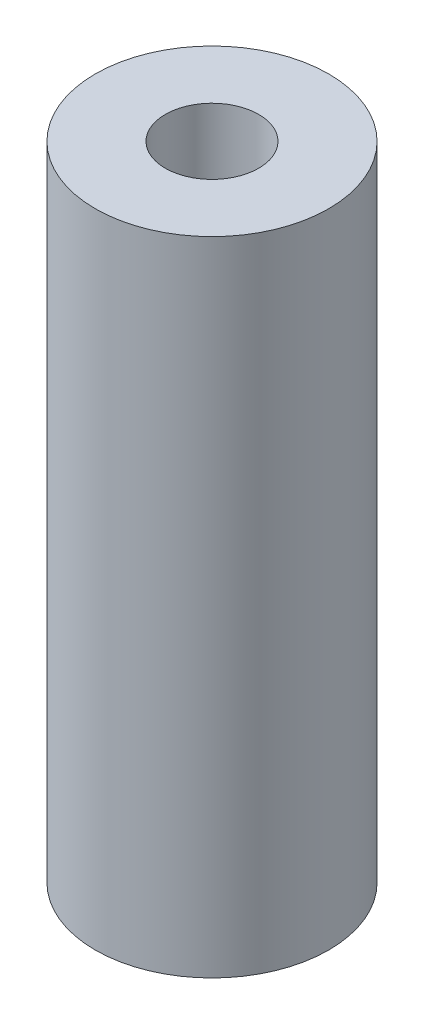
ISO-10303-21;
HEADER;
FILE_DESCRIPTION(('STEP AP214'),'2;1');
FILE_NAME('part.step','',(''),(''),'','','');
FILE_SCHEMA(('AUTOMOTIVE_DESIGN { 1 0 10303 214 1 1 1 1 }'));
ENDSEC;
DATA;
#1=APPLICATION_CONTEXT('core data for automotive mechanical design processes');
#2=APPLICATION_PROTOCOL_DEFINITION('international standard','automotive_design',2000,#1);
#3=PRODUCT_CONTEXT('',#1,'mechanical');
#4=PRODUCT('Part','Part','',(#3));
#5=PRODUCT_RELATED_PRODUCT_CATEGORY('part','',(#4));
#6=PRODUCT_DEFINITION_FORMATION('','',#4);
#7=PRODUCT_DEFINITION_CONTEXT('part definition',#1,'design');
#8=PRODUCT_DEFINITION('design','',#6,#7);
#9=PRODUCT_DEFINITION_SHAPE('','',#8);
#10=(LENGTH_UNIT() NAMED_UNIT(*) SI_UNIT(.MILLI.,.METRE.));
#11=(NAMED_UNIT(*) PLANE_ANGLE_UNIT() SI_UNIT($,.RADIAN.));
#12=(NAMED_UNIT(*) SI_UNIT($,.STERADIAN.) SOLID_ANGLE_UNIT());
#13=UNCERTAINTY_MEASURE_WITH_UNIT(LENGTH_MEASURE(1.E-05),#10,'distance_accuracy_value','');
#14=(GEOMETRIC_REPRESENTATION_CONTEXT(3) GLOBAL_UNCERTAINTY_ASSIGNED_CONTEXT((#13)) GLOBAL_UNIT_ASSIGNED_CONTEXT((#10,
#11,#12)) REPRESENTATION_CONTEXT('',''));
#15=CARTESIAN_POINT('',(0.,0.,0.));
#16=DIRECTION('',(0.,0.,1.));
#17=DIRECTION('',(1.,0.,0.));
#18=AXIS2_PLACEMENT_3D('',#15,#16,#17);
#19=CARTESIAN_POINT('',(0.,33.,0.));
#20=DIRECTION('',(0.,-1.,0.));
#21=DIRECTION('',(0.,0.,-1.));
#22=AXIS2_PLACEMENT_3D('',#19,#20,#21);
#23=CYLINDRICAL_SURFACE('',#22,6.);
#24=CARTESIAN_POINT('',(0.,33.,0.));
#25=DIRECTION('',(0.,1.,0.));
#26=DIRECTION('',(0.,0.,1.));
#27=AXIS2_PLACEMENT_3D('',#24,#25,#26);
#28=CIRCLE('',#27,6.);
#29=CARTESIAN_POINT('',(0.,33.,6.));
#30=VERTEX_POINT('',#29);
#31=EDGE_CURVE('E10',#30,#30,#28,.T.);
#32=ORIENTED_EDGE('',*,*,#31,.F.);
#33=EDGE_LOOP('',(#32));
#34=FACE_BOUND('',#33,.T.);
#35=CARTESIAN_POINT('',(0.,0.,0.));
#36=DIRECTION('',(0.,1.,0.));
#37=DIRECTION('',(0.,0.,1.));
#38=AXIS2_PLACEMENT_3D('',#35,#36,#37);
#39=CIRCLE('',#38,6.);
#40=CARTESIAN_POINT('',(0.,0.,6.));
#41=VERTEX_POINT('',#40);
#42=EDGE_CURVE('E38',#41,#41,#39,.T.);
#43=ORIENTED_EDGE('',*,*,#42,.T.);
#44=EDGE_LOOP('',(#43));
#45=FACE_BOUND('',#44,.T.);
#46=ADVANCED_FACE('F35',(#34,#45),#23,.T.);
#47=CARTESIAN_POINT('',(0.,33.,0.));
#48=DIRECTION('',(0.,1.,0.));
#49=DIRECTION('',(0.,0.,1.));
#50=AXIS2_PLACEMENT_3D('',#47,#48,#49);
#51=PLANE('',#50);
#52=CARTESIAN_POINT('',(0.,33.,0.));
#53=DIRECTION('',(0.,1.,0.));
#54=DIRECTION('',(0.,0.,1.));
#55=AXIS2_PLACEMENT_3D('',#52,#53,#54);
#56=CIRCLE('',#55,2.4);
#57=CARTESIAN_POINT('',(0.,33.,2.4));
#58=VERTEX_POINT('',#57);
#59=EDGE_CURVE('E49',#58,#58,#56,.T.);
#60=ORIENTED_EDGE('',*,*,#59,.F.);
#61=EDGE_LOOP('',(#60));
#62=FACE_BOUND('',#61,.T.);
#63=ORIENTED_EDGE('',*,*,#31,.T.);
#64=EDGE_LOOP('',(#63));
#65=FACE_BOUND('',#64,.T.);
#66=ADVANCED_FACE('F55',(#62,#65),#51,.T.);
#67=CARTESIAN_POINT('',(0.,0.,0.));
#68=DIRECTION('',(0.,1.,0.));
#69=DIRECTION('',(0.,0.,1.));
#70=AXIS2_PLACEMENT_3D('',#67,#68,#69);
#71=PLANE('',#70);
#72=CARTESIAN_POINT('',(0.,0.,0.));
#73=DIRECTION('',(0.,1.,0.));
#74=DIRECTION('',(0.,0.,1.));
#75=AXIS2_PLACEMENT_3D('',#72,#73,#74);
#76=CIRCLE('',#75,2.39999999999999);
#77=CARTESIAN_POINT('',(0.,0.,2.39999999999999));
#78=VERTEX_POINT('',#77);
#79=EDGE_CURVE('E45',#78,#78,#76,.T.);
#80=ORIENTED_EDGE('',*,*,#79,.T.);
#81=EDGE_LOOP('',(#80));
#82=FACE_BOUND('',#81,.T.);
#83=ORIENTED_EDGE('',*,*,#42,.F.);
#84=EDGE_LOOP('',(#83));
#85=FACE_BOUND('',#84,.T.);
#86=ADVANCED_FACE('F57',(#82,#85),#71,.F.);
#87=CARTESIAN_POINT('',(0.,33.,0.));
#88=DIRECTION('',(0.,1.,0.));
#89=DIRECTION('',(0.,0.,1.));
#90=AXIS2_PLACEMENT_3D('',#87,#88,#89);
#91=CYLINDRICAL_SURFACE('',#90,2.39999999999999);
#92=ORIENTED_EDGE('',*,*,#79,.F.);
#93=EDGE_LOOP('',(#92));
#94=FACE_BOUND('',#93,.T.);
#95=ORIENTED_EDGE('',*,*,#59,.T.);
#96=EDGE_LOOP('',(#95));
#97=FACE_BOUND('',#96,.T.);
#98=ADVANCED_FACE('F53',(#94,#97),#91,.F.);
#99=CLOSED_SHELL('',(#46,#66,#86,#98));
#100=MANIFOLD_SOLID_BREP('B2',#99);
#101=ADVANCED_BREP_SHAPE_REPRESENTATION('',(#18,#100),#14);
#102=SHAPE_DEFINITION_REPRESENTATION(#9,#101);
ENDSEC;
END-ISO-10303-21;
